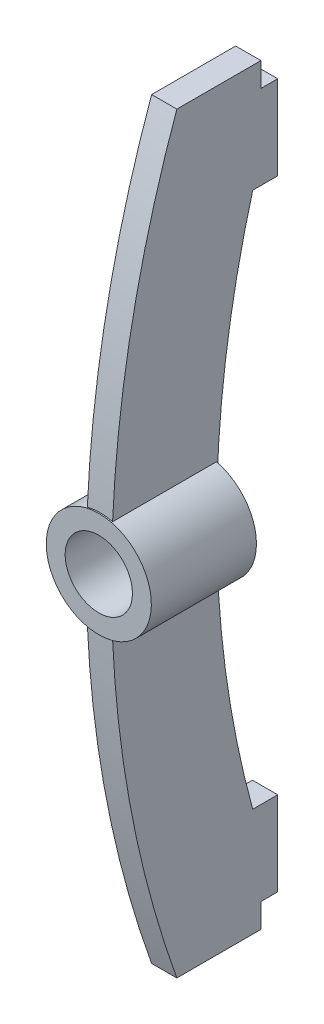
ISO-10303-21;
HEADER;
FILE_DESCRIPTION(('STEP AP214'),'2;1');
FILE_NAME('part.step','',(''),(''),'','','');
FILE_SCHEMA(('AUTOMOTIVE_DESIGN { 1 0 10303 214 1 1 1 1 }'));
ENDSEC;
DATA;
#1=APPLICATION_CONTEXT('core data for automotive mechanical design processes');
#2=APPLICATION_PROTOCOL_DEFINITION('international standard','automotive_design',2000,#1);
#3=PRODUCT_CONTEXT('',#1,'mechanical');
#4=PRODUCT('Part','Part','',(#3));
#5=PRODUCT_RELATED_PRODUCT_CATEGORY('part','',(#4));
#6=PRODUCT_DEFINITION_FORMATION('','',#4);
#7=PRODUCT_DEFINITION_CONTEXT('part definition',#1,'design');
#8=PRODUCT_DEFINITION('design','',#6,#7);
#9=PRODUCT_DEFINITION_SHAPE('','',#8);
#10=(LENGTH_UNIT() NAMED_UNIT(*) SI_UNIT(.MILLI.,.METRE.));
#11=(NAMED_UNIT(*) PLANE_ANGLE_UNIT() SI_UNIT($,.RADIAN.));
#12=(NAMED_UNIT(*) SI_UNIT($,.STERADIAN.) SOLID_ANGLE_UNIT());
#13=UNCERTAINTY_MEASURE_WITH_UNIT(LENGTH_MEASURE(1.E-05),#10,'distance_accuracy_value','');
#14=(GEOMETRIC_REPRESENTATION_CONTEXT(3) GLOBAL_UNCERTAINTY_ASSIGNED_CONTEXT((#13)) GLOBAL_UNIT_ASSIGNED_CONTEXT((#10,
#11,#12)) REPRESENTATION_CONTEXT('',''));
#15=CARTESIAN_POINT('',(0.,0.,0.));
#16=DIRECTION('',(0.,0.,1.));
#17=DIRECTION('',(1.,0.,0.));
#18=AXIS2_PLACEMENT_3D('',#15,#16,#17);
#19=CARTESIAN_POINT('',(6.,0.,-451.087885074878));
#20=DIRECTION('',(1.,0.,0.));
#21=DIRECTION('',(0.,0.,-1.));
#22=AXIS2_PLACEMENT_3D('',#19,#20,#21);
#23=PLANE('',#22);
#24=CARTESIAN_POINT('',(6.,0.,-451.087885074878));
#25=DIRECTION('',(-1.,0.,0.));
#26=DIRECTION('',(0.,0.,-1.));
#27=AXIS2_PLACEMENT_3D('',#24,#25,#26);
#28=CIRCLE('',#27,480.212865877789);
#29=CARTESIAN_POINT('',(6.,-127.5,11.8895944579376));
#30=VERTEX_POINT('',#29);
#31=CARTESIAN_POINT('',(6.,-14.8323969741913,28.8958610609247));
#32=VERTEX_POINT('',#31);
#33=EDGE_CURVE('E191',#30,#32,#28,.T.);
#34=ORIENTED_EDGE('',*,*,#33,.T.);
#35=DIRECTION('',(0.,0.,-1.));
#36=VECTOR('',#35,1.);
#37=CARTESIAN_POINT('',(6.,-14.8323969741913,79.1249808029103));
#38=LINE('',#37,#36);
#39=CARTESIAN_POINT('',(6.,-14.8323969741913,29.1249808029103));
#40=VERTEX_POINT('',#39);
#41=EDGE_CURVE('E178',#32,#40,#38,.F.);
#42=ORIENTED_EDGE('',*,*,#41,.T.);
#43=DIRECTION('',(0.,1.,0.));
#44=VECTOR('',#43,1.);
#45=CARTESIAN_POINT('',(6.,0.,29.1249808029103));
#46=LINE('',#45,#44);
#47=CARTESIAN_POINT('',(6.,-24.2693221990232,29.1249808029103));
#48=VERTEX_POINT('',#47);
#49=EDGE_CURVE('E189',#48,#40,#46,.T.);
#50=ORIENTED_EDGE('',*,*,#49,.F.);
#51=DIRECTION('',(0.,0.,-1.));
#52=VECTOR('',#51,1.);
#53=CARTESIAN_POINT('',(6.,-24.2693221990232,29.1249808029103));
#54=LINE('',#53,#52);
#55=CARTESIAN_POINT('',(6.,-24.2693221990232,78.5692522718565));
#56=VERTEX_POINT('',#55);
#57=EDGE_CURVE('E205',#56,#48,#54,.T.);
#58=ORIENTED_EDGE('',*,*,#57,.F.);
#59=CARTESIAN_POINT('',(6.,0.,-451.087885074878));
#60=DIRECTION('',(1.,0.,0.));
#61=DIRECTION('',(0.,0.,-1.));
#62=AXIS2_PLACEMENT_3D('',#59,#60,#61);
#63=CIRCLE('',#62,530.212865877789);
#64=CARTESIAN_POINT('',(6.,-178.988731806846,47.9999999999999));
#65=VERTEX_POINT('',#64);
#66=EDGE_CURVE('E219',#56,#65,#63,.T.);
#67=ORIENTED_EDGE('',*,*,#66,.T.);
#68=DIRECTION('',(0.,0.,-1.));
#69=VECTOR('',#68,1.);
#70=CARTESIAN_POINT('',(6.,-178.988731806846,48.));
#71=LINE('',#70,#69);
#72=CARTESIAN_POINT('',(6.,-178.988731806846,8.));
#73=VERTEX_POINT('',#72);
#74=EDGE_CURVE('E223',#65,#73,#71,.T.);
#75=ORIENTED_EDGE('',*,*,#74,.T.);
#76=DIRECTION('',(0.,1.,0.));
#77=VECTOR('',#76,1.);
#78=CARTESIAN_POINT('',(6.,-167.5,8.));
#79=LINE('',#78,#77);
#80=CARTESIAN_POINT('',(6.,-167.5,8.));
#81=VERTEX_POINT('',#80);
#82=EDGE_CURVE('E225',#73,#81,#79,.T.);
#83=ORIENTED_EDGE('',*,*,#82,.T.);
#84=DIRECTION('',(0.,0.,-1.));
#85=VECTOR('',#84,1.);
#86=CARTESIAN_POINT('',(6.,-167.5,0.));
#87=LINE('',#86,#85);
#88=CARTESIAN_POINT('',(6.,-167.5,0.));
#89=VERTEX_POINT('',#88);
#90=EDGE_CURVE('E227',#81,#89,#87,.T.);
#91=ORIENTED_EDGE('',*,*,#90,.T.);
#92=DIRECTION('',(0.,1.,0.));
#93=VECTOR('',#92,1.);
#94=CARTESIAN_POINT('',(6.,-167.5,0.));
#95=LINE('',#94,#93);
#96=CARTESIAN_POINT('',(6.,-127.5,0.));
#97=VERTEX_POINT('',#96);
#98=EDGE_CURVE('E229',#89,#97,#95,.T.);
#99=ORIENTED_EDGE('',*,*,#98,.T.);
#100=DIRECTION('',(0.,0.,1.));
#101=VECTOR('',#100,1.);
#102=CARTESIAN_POINT('',(6.,-127.5,0.));
#103=LINE('',#102,#101);
#104=EDGE_CURVE('E231',#97,#30,#103,.T.);
#105=ORIENTED_EDGE('',*,*,#104,.T.);
#106=EDGE_LOOP('',(#34,#42,#50,#58,#67,#75,#83,#91,#99,#105));
#107=FACE_BOUND('',#106,.T.);
#108=ADVANCED_FACE('F39',(#107),#23,.T.);
#109=CARTESIAN_POINT('',(-6.,0.,-451.087885074878));
#110=DIRECTION('',(1.,0.,0.));
#111=DIRECTION('',(0.,0.,-1.));
#112=AXIS2_PLACEMENT_3D('',#109,#110,#111);
#113=PLANE('',#112);
#114=DIRECTION('',(0.,0.,-1.));
#115=VECTOR('',#114,1.);
#116=CARTESIAN_POINT('',(-6.,-14.8323969741913,79.1249808029103));
#117=LINE('',#116,#115);
#118=CARTESIAN_POINT('',(-6.,-14.8323969741913,28.8958610609247));
#119=VERTEX_POINT('',#118);
#120=CARTESIAN_POINT('',(-6.,-14.8323969741913,29.1249808029103));
#121=VERTEX_POINT('',#120);
#122=EDGE_CURVE('E307',#119,#121,#117,.F.);
#123=ORIENTED_EDGE('',*,*,#122,.F.);
#124=CARTESIAN_POINT('',(-6.,0.,-451.087885074878));
#125=DIRECTION('',(-1.,0.,0.));
#126=DIRECTION('',(0.,0.,-1.));
#127=AXIS2_PLACEMENT_3D('',#124,#125,#126);
#128=CIRCLE('',#127,480.212865877789);
#129=CARTESIAN_POINT('',(-6.,-127.5,11.8895944579376));
#130=VERTEX_POINT('',#129);
#131=EDGE_CURVE('E258',#130,#119,#128,.T.);
#132=ORIENTED_EDGE('',*,*,#131,.F.);
#133=DIRECTION('',(0.,0.,1.));
#134=VECTOR('',#133,1.);
#135=CARTESIAN_POINT('',(-6.,-127.5,0.));
#136=LINE('',#135,#134);
#137=CARTESIAN_POINT('',(-6.,-127.5,0.));
#138=VERTEX_POINT('',#137);
#139=EDGE_CURVE('E255',#138,#130,#136,.T.);
#140=ORIENTED_EDGE('',*,*,#139,.F.);
#141=DIRECTION('',(0.,1.,0.));
#142=VECTOR('',#141,1.);
#143=CARTESIAN_POINT('',(-6.,-167.5,0.));
#144=LINE('',#143,#142);
#145=CARTESIAN_POINT('',(-6.,-167.5,0.));
#146=VERTEX_POINT('',#145);
#147=EDGE_CURVE('E253',#146,#138,#144,.T.);
#148=ORIENTED_EDGE('',*,*,#147,.F.);
#149=DIRECTION('',(0.,0.,-1.));
#150=VECTOR('',#149,1.);
#151=CARTESIAN_POINT('',(-6.,-167.5,0.));
#152=LINE('',#151,#150);
#153=CARTESIAN_POINT('',(-6.,-167.5,8.));
#154=VERTEX_POINT('',#153);
#155=EDGE_CURVE('E251',#154,#146,#152,.T.);
#156=ORIENTED_EDGE('',*,*,#155,.F.);
#157=DIRECTION('',(0.,1.,0.));
#158=VECTOR('',#157,1.);
#159=CARTESIAN_POINT('',(-6.,-167.5,8.));
#160=LINE('',#159,#158);
#161=CARTESIAN_POINT('',(-6.,-178.988731806846,8.));
#162=VERTEX_POINT('',#161);
#163=EDGE_CURVE('E249',#162,#154,#160,.T.);
#164=ORIENTED_EDGE('',*,*,#163,.F.);
#165=DIRECTION('',(0.,0.,-1.));
#166=VECTOR('',#165,1.);
#167=CARTESIAN_POINT('',(-6.,-178.988731806846,48.));
#168=LINE('',#167,#166);
#169=CARTESIAN_POINT('',(-6.,-178.988731806846,47.9999999999999));
#170=VERTEX_POINT('',#169);
#171=EDGE_CURVE('E247',#170,#162,#168,.T.);
#172=ORIENTED_EDGE('',*,*,#171,.F.);
#173=CARTESIAN_POINT('',(-6.,0.,-451.087885074878));
#174=DIRECTION('',(1.,0.,0.));
#175=DIRECTION('',(0.,0.,-1.));
#176=AXIS2_PLACEMENT_3D('',#173,#174,#175);
#177=CIRCLE('',#176,530.212865877789);
#178=CARTESIAN_POINT('',(-6.,-24.2693221990232,78.5692522718565));
#179=VERTEX_POINT('',#178);
#180=EDGE_CURVE('E243',#179,#170,#177,.T.);
#181=ORIENTED_EDGE('',*,*,#180,.F.);
#182=DIRECTION('',(0.,0.,-1.));
#183=VECTOR('',#182,1.);
#184=CARTESIAN_POINT('',(-6.,-24.2693221990232,29.1249808029103));
#185=LINE('',#184,#183);
#186=CARTESIAN_POINT('',(-6.,-24.2693221990232,29.1249808029103));
#187=VERTEX_POINT('',#186);
#188=EDGE_CURVE('E11',#179,#187,#185,.T.);
#189=ORIENTED_EDGE('',*,*,#188,.T.);
#190=DIRECTION('',(0.,1.,0.));
#191=VECTOR('',#190,1.);
#192=CARTESIAN_POINT('',(-6.,0.,29.1249808029103));
#193=LINE('',#192,#191);
#194=EDGE_CURVE('E47',#187,#121,#193,.T.);
#195=ORIENTED_EDGE('',*,*,#194,.T.);
#196=EDGE_LOOP('',(#123,#132,#140,#148,#156,#164,#172,#181,#189,#195));
#197=FACE_BOUND('',#196,.T.);
#198=ADVANCED_FACE('F305',(#197),#113,.F.);
#199=CARTESIAN_POINT('',(6.,0.,-451.087885074878));
#200=DIRECTION('',(-1.,0.,0.));
#201=DIRECTION('',(0.,0.,1.));
#202=AXIS2_PLACEMENT_3D('',#199,#200,#201);
#203=CYLINDRICAL_SURFACE('',#202,480.212865877789);
#204=CARTESIAN_POINT('',(6.,-14.8323969741913,28.8958610609247));
#205=CARTESIAN_POINT('',(5.79168353445935,-14.9166649076651,28.8932568627019));
#206=CARTESIAN_POINT('',(5.5816156905782,-14.9965342168367,28.8907667226108));
#207=CARTESIAN_POINT('',(5.15830135207668,-15.1473570700695,28.8860307247617));
#208=CARTESIAN_POINT('',(4.94505486625703,-15.2183106388107,28.8837848663274));
#209=CARTESIAN_POINT('',(4.30112906665285,-15.4175905400492,28.8774388997532));
#210=CARTESIAN_POINT('',(3.86616878630426,-15.5323743324861,28.8737292064851));
#211=CARTESIAN_POINT('',(2.98776566536412,-15.725002122429,28.8674567578758));
#212=CARTESIAN_POINT('',(2.54431522815701,-15.8028112595225,28.8648950850391));
#213=CARTESIAN_POINT('',(1.652439015585,-15.9207959411353,28.8609958558075));
#214=CARTESIAN_POINT('',(1.20401350704163,-15.9609734941221,28.8596582340828));
#215=CARTESIAN_POINT('',(0.305090773924771,-16.0034223920596,28.8582446934812));
#216=CARTESIAN_POINT('',(-0.145407580315785,-16.0056697779971,28.8581695720769));
#217=CARTESIAN_POINT('',(-1.04505819295424,-15.9721786681186,28.8592852917586));
#218=CARTESIAN_POINT('',(-1.49421024851244,-15.9364347110315,28.8604763148534));
#219=CARTESIAN_POINT('',(-2.3869619902578,-15.8273261304109,28.8640867552014));
#220=CARTESIAN_POINT('',(-2.83057121179004,-15.7540391927015,28.866503635747));
#221=CARTESIAN_POINT('',(-3.70986286595581,-15.5704356184608,28.8724950851874));
#222=CARTESIAN_POINT('',(-4.14554930391902,-15.4601382738477,28.8760690509101));
#223=CARTESIAN_POINT('',(-4.81703009671611,-15.2597404812017,28.8824702810199));
#224=CARTESIAN_POINT('',(-5.05659600351772,-15.1820365657781,28.8849363707527));
#225=CARTESIAN_POINT('',(-5.53150431910753,-15.0155151836659,28.8901745602633));
#226=CARTESIAN_POINT('',(-5.76685149279314,-14.9267112943118,28.892946285712));
#227=CARTESIAN_POINT('',(-6.,-14.8323969741913,28.8958610609248));
#228=B_SPLINE_CURVE_WITH_KNOTS('',3,(#204,#205,#206,#207,#208,#209,#210,#211,#212,#213,#214,
#215,#216,#217,#218,#219,#220,#221,#222,#223,#224,#225,#226,#227),.UNSPECIFIED.,.F.,.F.,(4,2,2,
2,2,2,2,2,2,2,2,4),(0.,0.674086000056864,1.34817013411289,2.6960331585099,4.04516446493335,
5.39422376160792,6.74413517476585,8.09424066448996,9.44156366543939,10.7881854535723,
11.5435286224987,12.2979567453878),.UNSPECIFIED.);
#229=EDGE_CURVE('E370',#32,#119,#228,.T.);
#230=ORIENTED_EDGE('',*,*,#229,.F.);
#231=ORIENTED_EDGE('',*,*,#33,.F.);
#232=DIRECTION('',(-1.,0.,0.));
#233=VECTOR('',#232,1.);
#234=CARTESIAN_POINT('',(6.,-127.5,11.8895944579376));
#235=LINE('',#234,#233);
#236=EDGE_CURVE('E267',#30,#130,#235,.T.);
#237=ORIENTED_EDGE('',*,*,#236,.T.);
#238=ORIENTED_EDGE('',*,*,#131,.T.);
#239=EDGE_LOOP('',(#230,#231,#237,#238));
#240=FACE_BOUND('',#239,.T.);
#241=ADVANCED_FACE('F349',(#240),#203,.F.);
#242=CARTESIAN_POINT('',(-6.,14.8323969741913,28.8958610609247));
#243=CARTESIAN_POINT('',(-5.79168353445935,14.9166649076651,28.8932568627019));
#244=CARTESIAN_POINT('',(-5.5816156905782,14.9965342168367,28.8907667226108));
#245=CARTESIAN_POINT('',(-5.15830135207668,15.1473570700695,28.8860307247617));
#246=CARTESIAN_POINT('',(-4.94505486625703,15.2183106388107,28.8837848663274));
#247=CARTESIAN_POINT('',(-4.30112906665285,15.4175905400492,28.8774388997532));
#248=CARTESIAN_POINT('',(-3.86616878630426,15.5323743324861,28.8737292064851));
#249=CARTESIAN_POINT('',(-2.98776566536412,15.725002122429,28.8674567578758));
#250=CARTESIAN_POINT('',(-2.54431522815701,15.8028112595225,28.8648950850391));
#251=CARTESIAN_POINT('',(-1.652439015585,15.9207959411353,28.8609958558075));
#252=CARTESIAN_POINT('',(-1.20401350704163,15.9609734941221,28.8596582340828));
#253=CARTESIAN_POINT('',(-0.305090773924771,16.0034223920596,28.8582446934812));
#254=CARTESIAN_POINT('',(0.145407580315785,16.0056697779971,28.8581695720769));
#255=CARTESIAN_POINT('',(1.04505819295424,15.9721786681186,28.8592852917586));
#256=CARTESIAN_POINT('',(1.49421024851244,15.9364347110315,28.8604763148534));
#257=CARTESIAN_POINT('',(2.3869619902578,15.8273261304109,28.8640867552014));
#258=CARTESIAN_POINT('',(2.83057121179004,15.7540391927015,28.866503635747));
#259=CARTESIAN_POINT('',(3.70986286595581,15.5704356184608,28.8724950851874));
#260=CARTESIAN_POINT('',(4.14554930391902,15.4601382738477,28.8760690509101));
#261=CARTESIAN_POINT('',(4.81703009671611,15.2597404812017,28.8824702810199));
#262=CARTESIAN_POINT('',(5.05659600351772,15.1820365657781,28.8849363707527));
#263=CARTESIAN_POINT('',(5.53150431910753,15.0155151836659,28.8901745602633));
#264=CARTESIAN_POINT('',(5.76685149279314,14.9267112943118,28.892946285712));
#265=CARTESIAN_POINT('',(6.,14.8323969741913,28.8958610609248));
#266=B_SPLINE_CURVE_WITH_KNOTS('',3,(#242,#243,#244,#245,#246,#247,#248,#249,#250,#251,#252,
#253,#254,#255,#256,#257,#258,#259,#260,#261,#262,#263,#264,#265),.UNSPECIFIED.,.F.,.F.,(4,2,2,
2,2,2,2,2,2,2,2,4),(0.,0.674086000056864,1.34817013411289,2.6960331585099,4.04516446493335,
5.39422376160792,6.74413517476585,8.09424066448996,9.44156366543939,10.7881854535723,
11.5435286224987,12.2979567453878),.UNSPECIFIED.);
#267=CARTESIAN_POINT('',(-6.,14.8323969741913,28.8958610609247));
#268=VERTEX_POINT('',#267);
#269=CARTESIAN_POINT('',(6.,14.8323969741913,28.8958610609247));
#270=VERTEX_POINT('',#269);
#271=EDGE_CURVE('E193',#268,#270,#266,.T.);
#272=ORIENTED_EDGE('',*,*,#271,.F.);
#273=CARTESIAN_POINT('',(-6.,127.5,11.8895944579376));
#274=VERTEX_POINT('',#273);
#275=EDGE_CURVE('E257',#268,#274,#128,.T.);
#276=ORIENTED_EDGE('',*,*,#275,.T.);
#277=DIRECTION('',(-1.,0.,0.));
#278=VECTOR('',#277,1.);
#279=CARTESIAN_POINT('',(6.,127.5,11.8895944579376));
#280=LINE('',#279,#278);
#281=CARTESIAN_POINT('',(6.,127.5,11.8895944579376));
#282=VERTEX_POINT('',#281);
#283=EDGE_CURVE('E264',#282,#274,#280,.T.);
#284=ORIENTED_EDGE('',*,*,#283,.F.);
#285=EDGE_CURVE('E233',#270,#282,#28,.T.);
#286=ORIENTED_EDGE('',*,*,#285,.F.);
#287=EDGE_LOOP('',(#272,#276,#284,#286));
#288=FACE_BOUND('',#287,.T.);
#289=ADVANCED_FACE('F359',(#288),#203,.F.);
#290=CARTESIAN_POINT('',(6.,14.8323969741913,29.1249808029103));
#291=VERTEX_POINT('',#290);
#292=CARTESIAN_POINT('',(6.,24.2693221990232,29.1249808029103));
#293=VERTEX_POINT('',#292);
#294=EDGE_CURVE('E200',#291,#293,#46,.T.);
#295=ORIENTED_EDGE('',*,*,#294,.F.);
#296=DIRECTION('',(0.,0.,-1.));
#297=VECTOR('',#296,1.);
#298=CARTESIAN_POINT('',(6.,14.8323969741913,79.1249808029103));
#299=LINE('',#298,#297);
#300=EDGE_CURVE('E54',#291,#270,#299,.T.);
#301=ORIENTED_EDGE('',*,*,#300,.T.);
#302=ORIENTED_EDGE('',*,*,#285,.T.);
#303=DIRECTION('',(0.,0.,-1.));
#304=VECTOR('',#303,1.);
#305=CARTESIAN_POINT('',(6.,127.5,0.));
#306=LINE('',#305,#304);
#307=CARTESIAN_POINT('',(6.,127.5,0.));
#308=VERTEX_POINT('',#307);
#309=EDGE_CURVE('E235',#282,#308,#306,.T.);
#310=ORIENTED_EDGE('',*,*,#309,.T.);
#311=DIRECTION('',(0.,1.,0.));
#312=VECTOR('',#311,1.);
#313=CARTESIAN_POINT('',(6.,167.5,0.));
#314=LINE('',#313,#312);
#315=CARTESIAN_POINT('',(6.,167.5,0.));
#316=VERTEX_POINT('',#315);
#317=EDGE_CURVE('E209',#308,#316,#314,.T.);
#318=ORIENTED_EDGE('',*,*,#317,.T.);
#319=DIRECTION('',(0.,0.,1.));
#320=VECTOR('',#319,1.);
#321=CARTESIAN_POINT('',(6.,167.5,0.));
#322=LINE('',#321,#320);
#323=CARTESIAN_POINT('',(6.,167.5,8.));
#324=VERTEX_POINT('',#323);
#325=EDGE_CURVE('E212',#316,#324,#322,.T.);
#326=ORIENTED_EDGE('',*,*,#325,.T.);
#327=DIRECTION('',(0.,1.,0.));
#328=VECTOR('',#327,1.);
#329=CARTESIAN_POINT('',(6.,167.5,8.));
#330=LINE('',#329,#328);
#331=CARTESIAN_POINT('',(6.,178.988731806846,8.));
#332=VERTEX_POINT('',#331);
#333=EDGE_CURVE('E215',#324,#332,#330,.T.);
#334=ORIENTED_EDGE('',*,*,#333,.T.);
#335=DIRECTION('',(0.,0.,1.));
#336=VECTOR('',#335,1.);
#337=CARTESIAN_POINT('',(6.,178.988731806846,48.));
#338=LINE('',#337,#336);
#339=CARTESIAN_POINT('',(6.,178.988731806846,48.));
#340=VERTEX_POINT('',#339);
#341=EDGE_CURVE('E217',#332,#340,#338,.T.);
#342=ORIENTED_EDGE('',*,*,#341,.T.);
#343=CARTESIAN_POINT('',(6.,24.2693221990232,78.5692522718564));
#344=VERTEX_POINT('',#343);
#345=EDGE_CURVE('E220',#340,#344,#63,.T.);
#346=ORIENTED_EDGE('',*,*,#345,.T.);
#347=DIRECTION('',(0.,0.,-1.));
#348=VECTOR('',#347,1.);
#349=CARTESIAN_POINT('',(6.,24.2693221990232,29.1249808029103));
#350=LINE('',#349,#348);
#351=EDGE_CURVE('E329',#293,#344,#350,.F.);
#352=ORIENTED_EDGE('',*,*,#351,.F.);
#353=EDGE_LOOP('',(#295,#301,#302,#310,#318,#326,#334,#342,#346,#352));
#354=FACE_BOUND('',#353,.T.);
#355=ADVANCED_FACE('F346',(#354),#23,.T.);
#356=DIRECTION('',(0.,0.,-1.));
#357=VECTOR('',#356,1.);
#358=CARTESIAN_POINT('',(-6.,14.8323969741913,79.1249808029103));
#359=LINE('',#358,#357);
#360=CARTESIAN_POINT('',(-6.,14.8323969741913,29.1249808029103));
#361=VERTEX_POINT('',#360);
#362=EDGE_CURVE('E192',#361,#268,#359,.T.);
#363=ORIENTED_EDGE('',*,*,#362,.F.);
#364=CARTESIAN_POINT('',(-6.,24.2693221990232,29.1249808029103));
#365=VERTEX_POINT('',#364);
#366=EDGE_CURVE('E298',#361,#365,#193,.T.);
#367=ORIENTED_EDGE('',*,*,#366,.T.);
#368=DIRECTION('',(0.,0.,-1.));
#369=VECTOR('',#368,1.);
#370=CARTESIAN_POINT('',(-6.,24.2693221990232,29.1249808029103));
#371=LINE('',#370,#369);
#372=CARTESIAN_POINT('',(-6.,24.2693221990232,78.5692522718565));
#373=VERTEX_POINT('',#372);
#374=EDGE_CURVE('E297',#365,#373,#371,.F.);
#375=ORIENTED_EDGE('',*,*,#374,.T.);
#376=CARTESIAN_POINT('',(-6.,178.988731806846,48.));
#377=VERTEX_POINT('',#376);
#378=EDGE_CURVE('E244',#377,#373,#177,.T.);
#379=ORIENTED_EDGE('',*,*,#378,.F.);
#380=DIRECTION('',(0.,0.,1.));
#381=VECTOR('',#380,1.);
#382=CARTESIAN_POINT('',(-6.,178.988731806846,48.));
#383=LINE('',#382,#381);
#384=CARTESIAN_POINT('',(-6.,178.988731806846,8.));
#385=VERTEX_POINT('',#384);
#386=EDGE_CURVE('E241',#385,#377,#383,.T.);
#387=ORIENTED_EDGE('',*,*,#386,.F.);
#388=DIRECTION('',(0.,1.,0.));
#389=VECTOR('',#388,1.);
#390=CARTESIAN_POINT('',(-6.,167.5,8.));
#391=LINE('',#390,#389);
#392=CARTESIAN_POINT('',(-6.,167.5,8.));
#393=VERTEX_POINT('',#392);
#394=EDGE_CURVE('E239',#393,#385,#391,.T.);
#395=ORIENTED_EDGE('',*,*,#394,.F.);
#396=DIRECTION('',(0.,0.,1.));
#397=VECTOR('',#396,1.);
#398=CARTESIAN_POINT('',(-6.,167.5,0.));
#399=LINE('',#398,#397);
#400=CARTESIAN_POINT('',(-6.,167.5,0.));
#401=VERTEX_POINT('',#400);
#402=EDGE_CURVE('E203',#401,#393,#399,.T.);
#403=ORIENTED_EDGE('',*,*,#402,.F.);
#404=DIRECTION('',(0.,1.,0.));
#405=VECTOR('',#404,1.);
#406=CARTESIAN_POINT('',(-6.,167.5,0.));
#407=LINE('',#406,#405);
#408=CARTESIAN_POINT('',(-6.,127.5,0.));
#409=VERTEX_POINT('',#408);
#410=EDGE_CURVE('E199',#409,#401,#407,.T.);
#411=ORIENTED_EDGE('',*,*,#410,.F.);
#412=DIRECTION('',(0.,0.,-1.));
#413=VECTOR('',#412,1.);
#414=CARTESIAN_POINT('',(-6.,127.5,0.));
#415=LINE('',#414,#413);
#416=EDGE_CURVE('E213',#274,#409,#415,.T.);
#417=ORIENTED_EDGE('',*,*,#416,.F.);
#418=ORIENTED_EDGE('',*,*,#275,.F.);
#419=EDGE_LOOP('',(#363,#367,#375,#379,#387,#395,#403,#411,#417,#418));
#420=FACE_BOUND('',#419,.T.);
#421=ADVANCED_FACE('F350',(#420),#113,.F.);
#422=CARTESIAN_POINT('',(6.,0.,-451.087885074878));
#423=DIRECTION('',(-1.,0.,0.));
#424=DIRECTION('',(0.,0.,1.));
#425=AXIS2_PLACEMENT_3D('',#422,#423,#424);
#426=CYLINDRICAL_SURFACE('',#425,530.212865877789);
#427=ORIENTED_EDGE('',*,*,#378,.T.);
#428=CARTESIAN_POINT('',(25.,0.,79.1249808029103));
#429=CARTESIAN_POINT('',(25.0000054311859,-0.701963834310164,79.1249815121446));
#430=CARTESIAN_POINT('',(24.9704228653697,-1.40383998913719,79.1235838669832));
#431=CARTESIAN_POINT('',(24.8523019877831,-2.80283187507664,79.1180338457396));
#432=CARTESIAN_POINT('',(24.7637484696859,-3.49994633147875,79.1138807591367));
#433=CARTESIAN_POINT('',(24.5281693912232,-4.88497073920826,79.1029300423354));
#434=CARTESIAN_POINT('',(24.3810803952023,-5.57286986501194,79.0961295432765));
#435=CARTESIAN_POINT('',(24.0294979485105,-6.93376455162779,79.0800780317793));
#436=CARTESIAN_POINT('',(23.8250082282009,-7.60676107786553,79.070827178587));
#437=CARTESIAN_POINT('',(23.3601943953775,-8.93278708648089,79.0501422289935));
#438=CARTESIAN_POINT('',(23.099897286654,-9.58582605182638,79.0387091887904));
#439=CARTESIAN_POINT('',(22.5252621249548,-10.8676535706085,79.0139808249644));
#440=CARTESIAN_POINT('',(22.2109232386882,-11.4964417499299,79.0006854726264));
#441=CARTESIAN_POINT('',(21.5305280840727,-12.7251485407077,78.9726127322616));
#442=CARTESIAN_POINT('',(21.1644844895983,-13.3250741787916,78.9578357076794));
#443=CARTESIAN_POINT('',(20.3832229811299,-14.4919710260249,78.9272153058722));
#444=CARTESIAN_POINT('',(19.9680052252102,-15.0589423410999,78.9113719320751));
#445=CARTESIAN_POINT('',(19.0909879060479,-16.1563592894574,78.879054319625));
#446=CARTESIAN_POINT('',(18.6291513645989,-16.68677535686,78.8625795867034));
#447=CARTESIAN_POINT('',(17.6624491053114,-17.7068248520802,78.8294782657039));
#448=CARTESIAN_POINT('',(17.1575833257806,-18.1964582214244,78.8128516774084));
#449=CARTESIAN_POINT('',(16.1083809716926,-19.1314886730943,78.7799175022456));
#450=CARTESIAN_POINT('',(15.56404280841,-19.5768839731689,78.763609928252));
#451=CARTESIAN_POINT('',(14.4397721159109,-20.4202545493192,78.7317771586935));
#452=CARTESIAN_POINT('',(13.8598395891274,-20.8182298286365,78.7162519630751));
#453=CARTESIAN_POINT('',(12.6682228874627,-21.5641002316324,78.6864179604374));
#454=CARTESIAN_POINT('',(12.0565245274615,-21.9119727155316,78.6721097045007));
#455=CARTESIAN_POINT('',(10.8059593421122,-22.5549456768361,78.6451242463112));
#456=CARTESIAN_POINT('',(10.167092505133,-22.8500461316489,78.6324470447566));
#457=CARTESIAN_POINT('',(8.86673442641615,-23.3853670528342,78.6090845045476));
#458=CARTESIAN_POINT('',(8.20524331635775,-23.6255878385582,78.5983991543024));
#459=CARTESIAN_POINT('',(6.86433910577239,-24.0494337725814,78.5793245230674));
#460=CARTESIAN_POINT('',(6.18492601940872,-24.2330589656052,78.570935240263));
#461=CARTESIAN_POINT('',(4.81353090834675,-24.5422826066113,78.5566971457371));
#462=CARTESIAN_POINT('',(4.12155870215584,-24.6679245123067,78.5508464315891));
#463=CARTESIAN_POINT('',(2.72947383745625,-24.8604850436358,78.5418428831197));
#464=CARTESIAN_POINT('',(2.02936118260113,-24.9274036956245,78.5386900475874));
#465=CARTESIAN_POINT('',(0.625984968811911,-25.0020378876357,78.5351720592806));
#466=CARTESIAN_POINT('',(-0.0772785693384227,-25.009753817596,78.534806888145));
#467=CARTESIAN_POINT('',(-1.48195251338026,-24.965928253094,78.5368745856236));
#468=CARTESIAN_POINT('',(-2.1833629200559,-24.9143867837102,78.5393074530537));
#469=CARTESIAN_POINT('',(-3.57877788554963,-24.7524807805911,78.5468988863562));
#470=CARTESIAN_POINT('',(-4.27278791329073,-24.6421632740619,78.5520552730893));
#471=CARTESIAN_POINT('',(-5.64903939488502,-24.363523568046,78.5649458290379));
#472=CARTESIAN_POINT('',(-6.33128085599596,-24.1952014043325,78.5726799966636));
#473=CARTESIAN_POINT('',(-7.67915337660658,-23.8017540471745,78.5905063918228));
#474=CARTESIAN_POINT('',(-8.3447843862029,-23.5766286830967,78.6005986264398));
#475=CARTESIAN_POINT('',(-9.65471265140064,-23.071180551564,78.6228545872002));
#476=CARTESIAN_POINT('',(-10.2990098941162,-22.7908577507699,78.6350183145948));
#477=CARTESIAN_POINT('',(-11.5619587427642,-22.1768868039333,78.661077381544));
#478=CARTESIAN_POINT('',(-12.1805999345623,-21.8432172654549,78.6749734152717));
#479=CARTESIAN_POINT('',(-13.3875785600077,-21.1250064407889,78.7040989612517));
#480=CARTESIAN_POINT('',(-13.9759159883439,-20.7404651456857,78.7193284737376));
#481=CARTESIAN_POINT('',(-15.1181244199816,-19.9232387279009,78.750689250244));
#482=CARTESIAN_POINT('',(-15.6719952434149,-19.4905533540065,78.7668205189697));
#483=CARTESIAN_POINT('',(-16.7413469162829,-18.5801079226034,78.7995276408743));
#484=CARTESIAN_POINT('',(-17.2568277394019,-18.1023478341974,78.816103494358));
#485=CARTESIAN_POINT('',(-18.2462330162029,-17.1046497295187,78.8492464734205));
#486=CARTESIAN_POINT('',(-18.7201164232814,-16.5846710060322,78.8658135746944));
#487=CARTESIAN_POINT('',(-19.6223986602583,-15.506629015446,78.8984528022797));
#488=CARTESIAN_POINT('',(-20.0507974585484,-14.9485657218809,78.9145249282472));
#489=CARTESIAN_POINT('',(-20.8590669691952,-13.798312239102,78.9457182620221));
#490=CARTESIAN_POINT('',(-21.2389376497041,-13.2061220274921,78.9608394692053));
#491=CARTESIAN_POINT('',(-21.947447740108,-11.9918167168303,78.989701936596));
#492=CARTESIAN_POINT('',(-22.2760871654419,-11.3697016267966,79.0034431972192));
#493=CARTESIAN_POINT('',(-22.8798009753855,-10.0999459300084,79.0291561743815));
#494=CARTESIAN_POINT('',(-23.1548738950809,-9.45230462575581,79.0411278425244));
#495=CARTESIAN_POINT('',(-23.6494794286476,-8.13611514259122,79.0629613181776));
#496=CARTESIAN_POINT('',(-23.8690120353128,-7.46756696096666,79.0728231254142));
#497=CARTESIAN_POINT('',(-24.2509655602492,-6.11432378379512,79.0901567539774));
#498=CARTESIAN_POINT('',(-24.4133867901412,-5.42962887637241,79.0976285883445));
#499=CARTESIAN_POINT('',(-24.6799555486129,-4.04896479620883,79.1099700636458));
#500=CARTESIAN_POINT('',(-24.7841031250432,-3.35299563272614,79.1148397067167));
#501=CARTESIAN_POINT('',(-24.9333059915261,-1.95541572959667,79.1218350623129));
#502=CARTESIAN_POINT('',(-24.9784180308237,-1.25381106109012,79.1239634099392));
#503=CARTESIAN_POINT('',(-25.0094121249451,0.15070802056602,79.1254244467677));
#504=CARTESIAN_POINT('',(-24.9952942175324,0.853622432880272,79.1247571377524));
#505=CARTESIAN_POINT('',(-24.907929738591,2.25575673103518,79.1206457991934));
#506=CARTESIAN_POINT('',(-24.8346833345392,2.95497662733462,79.1172017775147));
#507=CARTESIAN_POINT('',(-24.6295866187388,4.34474925719306,79.107634716917));
#508=CARTESIAN_POINT('',(-24.4977363104073,5.03530199125741,79.1015116781543));
#509=CARTESIAN_POINT('',(-24.1764476147519,6.40252207273995,79.086763559378));
#510=CARTESIAN_POINT('',(-23.9870351762758,7.07919553047191,79.0781396068494));
#511=CARTESIAN_POINT('',(-23.551953985989,8.41417432343876,79.058632874067));
#512=CARTESIAN_POINT('',(-23.306285257228,9.07247966619942,79.0477500947388));
#513=CARTESIAN_POINT('',(-22.7604411635467,10.3660572353662,79.0240337979203));
#514=CARTESIAN_POINT('',(-22.4602655828373,11.0013293705733,79.0112002727072));
#515=CARTESIAN_POINT('',(-21.8075437120916,12.2443381876581,78.9839457552655));
#516=CARTESIAN_POINT('',(-21.4549973807177,12.8520748478008,78.9695247617838));
#517=CARTESIAN_POINT('',(-20.6997493887834,14.0361628238137,78.9394919072171));
#518=CARTESIAN_POINT('',(-20.2970096825574,14.6124898503284,78.9238791463104));
#519=CARTESIAN_POINT('',(-19.4444466252712,15.7291754060966,78.891914783017));
#520=CARTESIAN_POINT('',(-18.9946232527573,16.2695339189609,78.8755631802937));
#521=CARTESIAN_POINT('',(-18.0510805046014,17.3104576403297,78.8425843511166));
#522=CARTESIAN_POINT('',(-17.5573609037495,17.8110226446485,78.8259571232491));
#523=CARTESIAN_POINT('',(-16.529526072563,18.7688097259911,78.7928983187139));
#524=CARTESIAN_POINT('',(-15.9954108256603,19.2260317852378,78.7764667421265));
#525=CARTESIAN_POINT('',(-14.8901320205147,20.0942332622178,78.7442523568921));
#526=CARTESIAN_POINT('',(-14.3189395866008,20.5051759396441,78.7284700699244));
#527=CARTESIAN_POINT('',(-13.1439369865581,21.2774808730507,78.6980163648509));
#528=CARTESIAN_POINT('',(-12.5401268005012,21.638843098739,78.683344947424));
#529=CARTESIAN_POINT('',(-11.3041770913924,22.3094125197842,78.655530105869));
#530=CARTESIAN_POINT('',(-10.6720376562104,22.6186198768977,78.6423866770021));
#531=CARTESIAN_POINT('',(-9.38391905082677,23.1826748707997,78.6180016881352));
#532=CARTESIAN_POINT('',(-8.72793989530208,23.437522541054,78.6067601269643));
#533=CARTESIAN_POINT('',(-7.3970842147822,23.8909424407633,78.5865031444883));
#534=CARTESIAN_POINT('',(-6.72221567859821,24.0895380770209,78.57748679746));
#535=CARTESIAN_POINT('',(-5.35811987473489,24.4291747348301,78.5619308398949));
#536=CARTESIAN_POINT('',(-4.66889260972775,24.5702157670925,78.5553912288972));
#537=CARTESIAN_POINT('',(-3.28098887685757,24.7937324577939,78.5449750410139));
#538=CARTESIAN_POINT('',(-2.58231244524438,24.8762083408414,78.5410984539152));
#539=CARTESIAN_POINT('',(-1.18048537793263,24.9820041475932,78.5361187495956));
#540=CARTESIAN_POINT('',(-0.477334745281151,25.0053241115803,78.5350156304861));
#541=CARTESIAN_POINT('',(0.927744509810743,24.9926471623734,78.5356139954875));
#542=CARTESIAN_POINT('',(1.62967365537262,24.9567080234657,78.5373127479318));
#543=CARTESIAN_POINT('',(3.02800398274454,24.825879685686,78.543461349428));
#544=CARTESIAN_POINT('',(3.72440516839102,24.7309905277292,78.5479111965705));
#545=CARTESIAN_POINT('',(5.10672994382105,24.4829409615337,78.5594354451077));
#546=CARTESIAN_POINT('',(5.79265351803868,24.3297804667338,78.5665098504011));
#547=CARTESIAN_POINT('',(7.14914936938346,23.9662829134539,78.5830821201583));
#548=CARTESIAN_POINT('',(7.81972164194342,23.7559458379635,78.5925799853431));
#549=CARTESIAN_POINT('',(9.1407608350407,23.2795942795684,78.6137294448801));
#550=CARTESIAN_POINT('',(9.79122758715532,23.0135793303986,78.6253810572685));
#551=CARTESIAN_POINT('',(11.067437909044,22.4277682917578,78.650507197285));
#552=CARTESIAN_POINT('',(11.6931814769809,22.1079721982902,78.6639817250488));
#553=CARTESIAN_POINT('',(12.9154931242899,21.4168843134696,78.6923710163706));
#554=CARTESIAN_POINT('',(13.5120621509228,21.0455941955664,78.7072857331207));
#555=CARTESIAN_POINT('',(14.671823971912,20.2541462759557,78.7381330362309));
#556=CARTESIAN_POINT('',(15.2350167721964,19.833988482928,78.7540656224102));
#557=CARTESIAN_POINT('',(16.3245128677073,18.9473999563023,78.7865114076333));
#558=CARTESIAN_POINT('',(16.8507838756975,18.4809295634075,78.8030250963495));
#559=CARTESIAN_POINT('',(17.8621734549739,17.5053260539669,78.8361517970069));
#560=CARTESIAN_POINT('',(18.3472918419207,16.9961927463368,78.8527648093927));
#561=CARTESIAN_POINT('',(19.2730511818098,15.9387399362677,78.8856232530505));
#562=CARTESIAN_POINT('',(19.7136808747493,15.3904105730619,78.9018685904616));
#563=CARTESIAN_POINT('',(20.547188047489,14.2585764859658,78.9335263593446));
#564=CARTESIAN_POINT('',(20.9400662650782,13.6750723057559,78.9489388036832));
#565=CARTESIAN_POINT('',(21.6756096392643,12.4764891693785,78.9785069656093));
#566=CARTESIAN_POINT('',(22.0182302393441,11.8613828404015,78.9926615637083));
#567=CARTESIAN_POINT('',(22.6504209266184,10.6044045488237,79.0192974016817));
#568=CARTESIAN_POINT('',(22.9399875310946,9.96253083247629,79.0317785316874));
#569=CARTESIAN_POINT('',(23.4636882988487,8.65732067517777,79.0546989264955));
#570=CARTESIAN_POINT('',(23.6978826262361,7.99400842741266,79.0651404052925));
#571=CARTESIAN_POINT('',(24.1095125098712,6.65020443182678,79.0836999294073));
#572=CARTESIAN_POINT('',(24.2869627647504,5.96971718226789,79.0918185763595));
#573=CARTESIAN_POINT('',(24.6228911945528,4.41585070095733,79.1072999933221));
#574=CARTESIAN_POINT('',(24.7641835670741,3.5386952098422,79.1139058957092));
#575=CARTESIAN_POINT('',(24.9527345026251,1.77431313297247,79.1227458507194));
#576=CARTESIAN_POINT('',(24.9999931364954,0.887086554805444,79.1249799066359));
#577=CARTESIAN_POINT('',(25.,0.,79.1249808029103));
#578=B_SPLINE_CURVE_WITH_KNOTS('',3,(#428,#429,#430,#431,#432,#433,#434,#435,#436,#437,#438,
#439,#440,#441,#442,#443,#444,#445,#446,#447,#448,#449,#450,#451,#452,#453,#454,#455,#456,#457,
#458,#459,#460,#461,#462,#463,#464,#465,#466,#467,#468,#469,#470,#471,#472,#473,#474,#475,#476,
#477,#478,#479,#480,#481,#482,#483,#484,#485,#486,#487,#488,#489,#490,#491,#492,#493,#494,#495,
#496,#497,#498,#499,#500,#501,#502,#503,#504,#505,#506,#507,#508,#509,#510,#511,#512,#513,#514,
#515,#516,#517,#518,#519,#520,#521,#522,#523,#524,#525,#526,#527,#528,#529,#530,#531,#532,#533,
#534,#535,#536,#537,#538,#539,#540,#541,#542,#543,#544,#545,#546,#547,#548,#549,#550,#551,#552,
#553,#554,#555,#556,#557,#558,#559,#560,#561,#562,#563,#564,#565,#566,#567,#568,#569,#570,#571,
#572,#573,#574,#575,#576,#577),.UNSPECIFIED.,.T.,.F.,(4,2,2,2,2,2,2,2,2,2,2,2,2,2,2,2,2,2,2,2,2,
2,2,2,2,2,2,2,2,2,2,2,2,2,2,2,2,2,2,2,2,2,2,2,2,2,2,2,2,2,2,2,2,2,2,2,2,2,2,2,2,2,2,2,2,2,2,2,2,
2,2,2,2,2,4),(0.,2.10511644331063,4.21077592500443,6.31872357849742,8.426534272278,
10.5333273421391,12.6401529003642,14.7464629261339,16.8527661811835,18.9607534925992,
21.0687438263513,23.1768190518219,25.2848941331923,27.3939188146242,29.5029443989557,
31.6119577102909,33.7209693549768,35.8283977457178,37.9358251906469,40.043238755025,
42.150651427523,44.2563804678586,46.3621082095306,48.4678422767528,50.5735776158376,
52.6801594981372,54.7867417496338,56.8933349936642,58.9999296817115,61.1085802355286,
63.2172322546863,65.32588565769,67.4345384252361,69.5432488512416,71.6519595508419,
73.7606587443573,75.8693562063405,77.9760251426042,80.0826927357076,82.1893543618606,
84.2960158651804,86.4017290965731,88.5074414652016,90.6131621703979,92.7188845377087,
94.8262128238748,96.9335420702497,99.0408821289117,101.148223051894,103.257225331144,
105.366228898915,107.475225925564,109.584221653835,111.692338523037,113.800454999917,
115.908563391721,118.01667034799,120.122723233752,122.228774657773,124.334829210315,
126.440884389422,128.546957206044,130.653030179174,132.759034725304,134.865038897373,
136.972862339036,139.080695222005,141.189060263085,143.297392724516,145.407583201447,
147.517912151794,149.625937501656,151.733416358588,154.393698567888,157.053978773058),.UNSPECIFIED.);
#579=EDGE_CURVE('E62',#373,#344,#578,.T.);
#580=ORIENTED_EDGE('',*,*,#579,.T.);
#581=ORIENTED_EDGE('',*,*,#345,.F.);
#582=DIRECTION('',(-1.,0.,0.));
#583=VECTOR('',#582,1.);
#584=CARTESIAN_POINT('',(6.,178.988731806846,48.));
#585=LINE('',#584,#583);
#586=EDGE_CURVE('E285',#340,#377,#585,.T.);
#587=ORIENTED_EDGE('',*,*,#586,.T.);
#588=EDGE_LOOP('',(#427,#580,#581,#587));
#589=FACE_BOUND('',#588,.T.);
#590=ADVANCED_FACE('F420',(#589),#426,.T.);
#591=CARTESIAN_POINT('',(6.,167.5,0.));
#592=DIRECTION('',(0.,0.,1.));
#593=DIRECTION('',(0.,-1.,0.));
#594=AXIS2_PLACEMENT_3D('',#591,#592,#593);
#595=PLANE('',#594);
#596=ORIENTED_EDGE('',*,*,#410,.T.);
#597=DIRECTION('',(-1.,0.,0.));
#598=VECTOR('',#597,1.);
#599=CARTESIAN_POINT('',(6.,167.5,0.));
#600=LINE('',#599,#598);
#601=EDGE_CURVE('E294',#316,#401,#600,.T.);
#602=ORIENTED_EDGE('',*,*,#601,.F.);
#603=ORIENTED_EDGE('',*,*,#317,.F.);
#604=DIRECTION('',(-1.,0.,0.));
#605=VECTOR('',#604,1.);
#606=CARTESIAN_POINT('',(6.,127.5,0.));
#607=LINE('',#606,#605);
#608=EDGE_CURVE('E236',#308,#409,#607,.T.);
#609=ORIENTED_EDGE('',*,*,#608,.T.);
#610=EDGE_LOOP('',(#596,#602,#603,#609));
#611=FACE_BOUND('',#610,.T.);
#612=ADVANCED_FACE('F41',(#611),#595,.F.);
#613=CARTESIAN_POINT('',(6.,167.5,0.));
#614=DIRECTION('',(0.,-1.,0.));
#615=DIRECTION('',(0.,0.,-1.));
#616=AXIS2_PLACEMENT_3D('',#613,#614,#615);
#617=PLANE('',#616);
#618=ORIENTED_EDGE('',*,*,#402,.T.);
#619=DIRECTION('',(-1.,0.,0.));
#620=VECTOR('',#619,1.);
#621=CARTESIAN_POINT('',(6.,167.5,8.));
#622=LINE('',#621,#620);
#623=EDGE_CURVE('E291',#324,#393,#622,.T.);
#624=ORIENTED_EDGE('',*,*,#623,.F.);
#625=ORIENTED_EDGE('',*,*,#325,.F.);
#626=ORIENTED_EDGE('',*,*,#601,.T.);
#627=EDGE_LOOP('',(#618,#624,#625,#626));
#628=FACE_BOUND('',#627,.T.);
#629=ADVANCED_FACE('F408',(#628),#617,.F.);
#630=CARTESIAN_POINT('',(6.,167.5,8.));
#631=DIRECTION('',(0.,0.,1.));
#632=DIRECTION('',(1.,0.,0.));
#633=AXIS2_PLACEMENT_3D('',#630,#631,#632);
#634=PLANE('',#633);
#635=ORIENTED_EDGE('',*,*,#394,.T.);
#636=DIRECTION('',(-1.,0.,0.));
#637=VECTOR('',#636,1.);
#638=CARTESIAN_POINT('',(6.,178.988731806846,8.));
#639=LINE('',#638,#637);
#640=EDGE_CURVE('E288',#332,#385,#639,.T.);
#641=ORIENTED_EDGE('',*,*,#640,.F.);
#642=ORIENTED_EDGE('',*,*,#333,.F.);
#643=ORIENTED_EDGE('',*,*,#623,.T.);
#644=EDGE_LOOP('',(#635,#641,#642,#643));
#645=FACE_BOUND('',#644,.T.);
#646=ADVANCED_FACE('F411',(#645),#634,.F.);
#647=CARTESIAN_POINT('',(6.,178.988731806846,48.));
#648=DIRECTION('',(0.,-1.,0.));
#649=DIRECTION('',(0.,0.,-1.));
#650=AXIS2_PLACEMENT_3D('',#647,#648,#649);
#651=PLANE('',#650);
#652=ORIENTED_EDGE('',*,*,#386,.T.);
#653=ORIENTED_EDGE('',*,*,#586,.F.);
#654=ORIENTED_EDGE('',*,*,#341,.F.);
#655=ORIENTED_EDGE('',*,*,#640,.T.);
#656=EDGE_LOOP('',(#652,#653,#654,#655));
#657=FACE_BOUND('',#656,.T.);
#658=ADVANCED_FACE('F416',(#657),#651,.F.);
#659=ORIENTED_EDGE('',*,*,#66,.F.);
#660=EDGE_CURVE('E330',#56,#179,#578,.T.);
#661=ORIENTED_EDGE('',*,*,#660,.T.);
#662=ORIENTED_EDGE('',*,*,#180,.T.);
#663=DIRECTION('',(-1.,0.,0.));
#664=VECTOR('',#663,1.);
#665=CARTESIAN_POINT('',(6.,-178.988731806846,47.9999999999999));
#666=LINE('',#665,#664);
#667=EDGE_CURVE('E282',#65,#170,#666,.T.);
#668=ORIENTED_EDGE('',*,*,#667,.F.);
#669=EDGE_LOOP('',(#659,#661,#662,#668));
#670=FACE_BOUND('',#669,.T.);
#671=ADVANCED_FACE('F331',(#670),#426,.T.);
#672=CARTESIAN_POINT('',(6.,-178.988731806846,48.));
#673=DIRECTION('',(0.,1.,0.));
#674=DIRECTION('',(0.,0.,1.));
#675=AXIS2_PLACEMENT_3D('',#672,#673,#674);
#676=PLANE('',#675);
#677=ORIENTED_EDGE('',*,*,#171,.T.);
#678=DIRECTION('',(-1.,0.,0.));
#679=VECTOR('',#678,1.);
#680=CARTESIAN_POINT('',(6.,-178.988731806846,8.));
#681=LINE('',#680,#679);
#682=EDGE_CURVE('E279',#73,#162,#681,.T.);
#683=ORIENTED_EDGE('',*,*,#682,.F.);
#684=ORIENTED_EDGE('',*,*,#74,.F.);
#685=ORIENTED_EDGE('',*,*,#667,.T.);
#686=EDGE_LOOP('',(#677,#683,#684,#685));
#687=FACE_BOUND('',#686,.T.);
#688=ADVANCED_FACE('F428',(#687),#676,.F.);
#689=CARTESIAN_POINT('',(6.,-167.5,8.));
#690=DIRECTION('',(0.,0.,1.));
#691=DIRECTION('',(1.,0.,0.));
#692=AXIS2_PLACEMENT_3D('',#689,#690,#691);
#693=PLANE('',#692);
#694=ORIENTED_EDGE('',*,*,#163,.T.);
#695=DIRECTION('',(-1.,0.,0.));
#696=VECTOR('',#695,1.);
#697=CARTESIAN_POINT('',(6.,-167.5,8.));
#698=LINE('',#697,#696);
#699=EDGE_CURVE('E276',#81,#154,#698,.T.);
#700=ORIENTED_EDGE('',*,*,#699,.F.);
#701=ORIENTED_EDGE('',*,*,#82,.F.);
#702=ORIENTED_EDGE('',*,*,#682,.T.);
#703=EDGE_LOOP('',(#694,#700,#701,#702));
#704=FACE_BOUND('',#703,.T.);
#705=ADVANCED_FACE('F433',(#704),#693,.F.);
#706=CARTESIAN_POINT('',(6.,-167.5,0.));
#707=DIRECTION('',(0.,1.,0.));
#708=DIRECTION('',(0.,0.,1.));
#709=AXIS2_PLACEMENT_3D('',#706,#707,#708);
#710=PLANE('',#709);
#711=ORIENTED_EDGE('',*,*,#155,.T.);
#712=DIRECTION('',(-1.,0.,0.));
#713=VECTOR('',#712,1.);
#714=CARTESIAN_POINT('',(6.,-167.5,0.));
#715=LINE('',#714,#713);
#716=EDGE_CURVE('E273',#89,#146,#715,.T.);
#717=ORIENTED_EDGE('',*,*,#716,.F.);
#718=ORIENTED_EDGE('',*,*,#90,.F.);
#719=ORIENTED_EDGE('',*,*,#699,.T.);
#720=EDGE_LOOP('',(#711,#717,#718,#719));
#721=FACE_BOUND('',#720,.T.);
#722=ADVANCED_FACE('F449',(#721),#710,.F.);
#723=CARTESIAN_POINT('',(6.,-167.5,0.));
#724=DIRECTION('',(0.,0.,1.));
#725=DIRECTION('',(1.,0.,0.));
#726=AXIS2_PLACEMENT_3D('',#723,#724,#725);
#727=PLANE('',#726);
#728=ORIENTED_EDGE('',*,*,#147,.T.);
#729=DIRECTION('',(-1.,0.,0.));
#730=VECTOR('',#729,1.);
#731=CARTESIAN_POINT('',(6.,-127.5,0.));
#732=LINE('',#731,#730);
#733=EDGE_CURVE('E270',#97,#138,#732,.T.);
#734=ORIENTED_EDGE('',*,*,#733,.F.);
#735=ORIENTED_EDGE('',*,*,#98,.F.);
#736=ORIENTED_EDGE('',*,*,#716,.T.);
#737=EDGE_LOOP('',(#728,#734,#735,#736));
#738=FACE_BOUND('',#737,.T.);
#739=ADVANCED_FACE('F455',(#738),#727,.F.);
#740=CARTESIAN_POINT('',(6.,-127.5,0.));
#741=DIRECTION('',(0.,-1.,0.));
#742=DIRECTION('',(0.,0.,-1.));
#743=AXIS2_PLACEMENT_3D('',#740,#741,#742);
#744=PLANE('',#743);
#745=ORIENTED_EDGE('',*,*,#139,.T.);
#746=ORIENTED_EDGE('',*,*,#236,.F.);
#747=ORIENTED_EDGE('',*,*,#104,.F.);
#748=ORIENTED_EDGE('',*,*,#733,.T.);
#749=EDGE_LOOP('',(#745,#746,#747,#748));
#750=FACE_BOUND('',#749,.T.);
#751=ADVANCED_FACE('F354',(#750),#744,.F.);
#752=CARTESIAN_POINT('',(6.,127.5,0.));
#753=DIRECTION('',(0.,1.,0.));
#754=DIRECTION('',(0.,0.,1.));
#755=AXIS2_PLACEMENT_3D('',#752,#753,#754);
#756=PLANE('',#755);
#757=ORIENTED_EDGE('',*,*,#416,.T.);
#758=ORIENTED_EDGE('',*,*,#608,.F.);
#759=ORIENTED_EDGE('',*,*,#309,.F.);
#760=ORIENTED_EDGE('',*,*,#283,.T.);
#761=EDGE_LOOP('',(#757,#758,#759,#760));
#762=FACE_BOUND('',#761,.T.);
#763=ADVANCED_FACE('F351',(#762),#756,.F.);
#764=CARTESIAN_POINT('',(0.,0.,29.1249808029103));
#765=DIRECTION('',(0.,0.,-1.));
#766=DIRECTION('',(0.,1.,0.));
#767=AXIS2_PLACEMENT_3D('',#764,#765,#766);
#768=PLANE('',#767);
#769=ORIENTED_EDGE('',*,*,#366,.F.);
#770=CARTESIAN_POINT('',(0.,0.,29.1249808029103));
#771=DIRECTION('',(0.,0.,-1.));
#772=DIRECTION('',(0.,1.,0.));
#773=AXIS2_PLACEMENT_3D('',#770,#771,#772);
#774=CIRCLE('',#773,16.);
#775=EDGE_CURVE('E315',#361,#121,#774,.F.);
#776=ORIENTED_EDGE('',*,*,#775,.T.);
#777=ORIENTED_EDGE('',*,*,#194,.F.);
#778=CARTESIAN_POINT('',(0.,0.,29.1249808029103));
#779=DIRECTION('',(0.,0.,-1.));
#780=DIRECTION('',(0.,1.,0.));
#781=AXIS2_PLACEMENT_3D('',#778,#779,#780);
#782=CIRCLE('',#781,25.);
#783=EDGE_CURVE('E314',#187,#365,#782,.T.);
#784=ORIENTED_EDGE('',*,*,#783,.T.);
#785=EDGE_LOOP('',(#769,#776,#777,#784));
#786=FACE_BOUND('',#785,.T.);
#787=ADVANCED_FACE('F313',(#786),#768,.T.);
#788=ORIENTED_EDGE('',*,*,#49,.T.);
#789=CARTESIAN_POINT('',(0.,0.,29.1249808029103));
#790=DIRECTION('',(0.,0.,-1.));
#791=DIRECTION('',(0.,1.,0.));
#792=AXIS2_PLACEMENT_3D('',#789,#790,#791);
#793=CIRCLE('',#792,16.);
#794=EDGE_CURVE('E174',#40,#291,#793,.F.);
#795=ORIENTED_EDGE('',*,*,#794,.T.);
#796=ORIENTED_EDGE('',*,*,#294,.T.);
#797=EDGE_CURVE('E198',#293,#48,#782,.T.);
#798=ORIENTED_EDGE('',*,*,#797,.T.);
#799=EDGE_LOOP('',(#788,#795,#796,#798));
#800=FACE_BOUND('',#799,.T.);
#801=ADVANCED_FACE('F196',(#800),#768,.T.);
#802=CARTESIAN_POINT('',(0.,0.,29.1249808029103));
#803=DIRECTION('',(0.,0.,-1.));
#804=DIRECTION('',(0.,1.,0.));
#805=AXIS2_PLACEMENT_3D('',#802,#803,#804);
#806=CYLINDRICAL_SURFACE('',#805,25.);
#807=CARTESIAN_POINT('',(0.,0.,79.1249808029103));
#808=DIRECTION('',(0.,0.,-1.));
#809=DIRECTION('',(0.,1.,0.));
#810=AXIS2_PLACEMENT_3D('',#807,#808,#809);
#811=CIRCLE('',#810,25.);
#812=CARTESIAN_POINT('',(0.,25.,79.1249808029103));
#813=VERTEX_POINT('',#812);
#814=EDGE_CURVE('E318',#813,#813,#811,.T.);
#815=ORIENTED_EDGE('',*,*,#814,.T.);
#816=EDGE_LOOP('',(#815));
#817=FACE_BOUND('',#816,.T.);
#818=ORIENTED_EDGE('',*,*,#660,.F.);
#819=ORIENTED_EDGE('',*,*,#57,.T.);
#820=ORIENTED_EDGE('',*,*,#797,.F.);
#821=ORIENTED_EDGE('',*,*,#351,.T.);
#822=ORIENTED_EDGE('',*,*,#579,.F.);
#823=ORIENTED_EDGE('',*,*,#374,.F.);
#824=ORIENTED_EDGE('',*,*,#783,.F.);
#825=ORIENTED_EDGE('',*,*,#188,.F.);
#826=EDGE_LOOP('',(#818,#819,#820,#821,#822,#823,#824,#825));
#827=FACE_BOUND('',#826,.T.);
#828=ADVANCED_FACE('F316',(#817,#827),#806,.T.);
#829=CARTESIAN_POINT('',(0.,0.,79.1249808029103));
#830=DIRECTION('',(0.,0.,1.));
#831=DIRECTION('',(0.,-1.,0.));
#832=AXIS2_PLACEMENT_3D('',#829,#830,#831);
#833=PLANE('',#832);
#834=CARTESIAN_POINT('',(0.,0.,79.1249808029103));
#835=DIRECTION('',(0.,0.,1.));
#836=DIRECTION('',(1.,0.,0.));
#837=AXIS2_PLACEMENT_3D('',#834,#835,#836);
#838=CIRCLE('',#837,16.);
#839=CARTESIAN_POINT('',(16.,0.,79.1249808029103));
#840=VERTEX_POINT('',#839);
#841=EDGE_CURVE('E183',#840,#840,#838,.T.);
#842=ORIENTED_EDGE('',*,*,#841,.F.);
#843=EDGE_LOOP('',(#842));
#844=FACE_BOUND('',#843,.T.);
#845=ORIENTED_EDGE('',*,*,#814,.F.);
#846=EDGE_LOOP('',(#845));
#847=FACE_BOUND('',#846,.T.);
#848=ADVANCED_FACE('F339',(#844,#847),#833,.T.);
#849=CARTESIAN_POINT('',(0.,0.,79.1249808029103));
#850=DIRECTION('',(0.,0.,-1.));
#851=DIRECTION('',(-1.,0.,0.));
#852=AXIS2_PLACEMENT_3D('',#849,#850,#851);
#853=CYLINDRICAL_SURFACE('',#852,16.);
#854=ORIENTED_EDGE('',*,*,#362,.T.);
#855=ORIENTED_EDGE('',*,*,#271,.T.);
#856=ORIENTED_EDGE('',*,*,#300,.F.);
#857=ORIENTED_EDGE('',*,*,#794,.F.);
#858=ORIENTED_EDGE('',*,*,#41,.F.);
#859=ORIENTED_EDGE('',*,*,#229,.T.);
#860=ORIENTED_EDGE('',*,*,#122,.T.);
#861=ORIENTED_EDGE('',*,*,#775,.F.);
#862=EDGE_LOOP('',(#854,#855,#856,#857,#858,#859,#860,#861));
#863=FACE_BOUND('',#862,.T.);
#864=ORIENTED_EDGE('',*,*,#841,.T.);
#865=EDGE_LOOP('',(#864));
#866=FACE_BOUND('',#865,.T.);
#867=ADVANCED_FACE('F176',(#863,#866),#853,.F.);
#868=CLOSED_SHELL('',(#108,#198,#241,#289,#355,#421,#590,#612,#629,#646,#658,#671,#688,#705,
#722,#739,#751,#763,#787,#801,#828,#848,#867));
#869=MANIFOLD_SOLID_BREP('B2',#868);
#870=ADVANCED_BREP_SHAPE_REPRESENTATION('',(#18,#869),#14);
#871=SHAPE_DEFINITION_REPRESENTATION(#9,#870);
ENDSEC;
END-ISO-10303-21;
